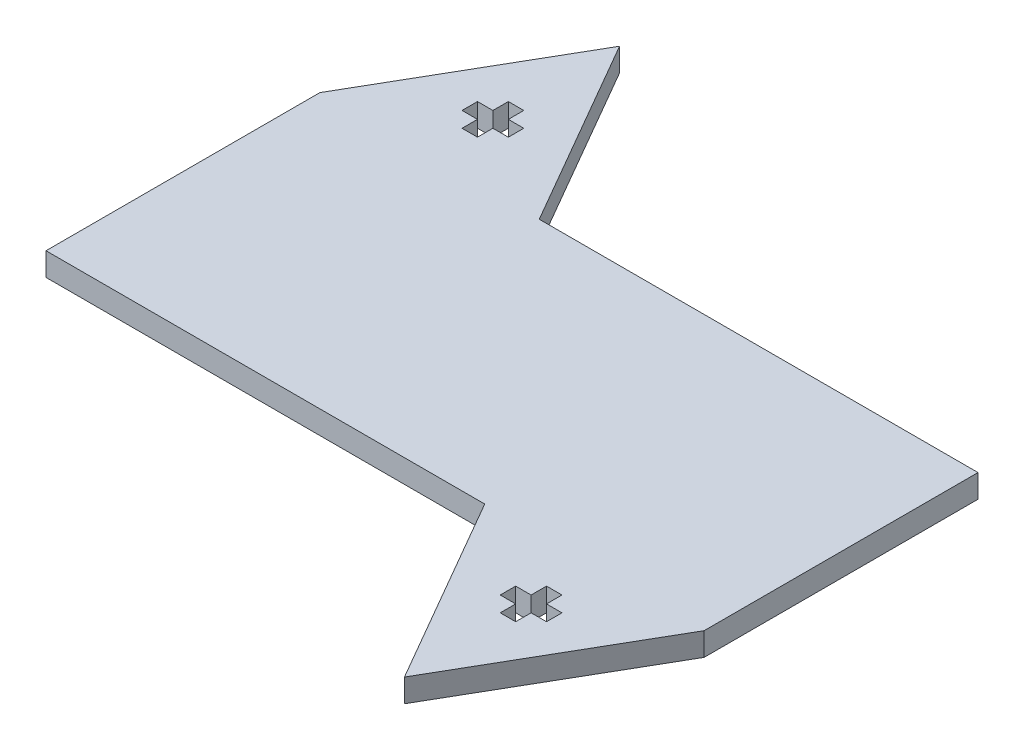
ISO-10303-21;
HEADER;
FILE_DESCRIPTION(('STEP AP214'),'2;1');
FILE_NAME('part.step','',(''),(''),'','','');
FILE_SCHEMA(('AUTOMOTIVE_DESIGN { 1 0 10303 214 1 1 1 1 }'));
ENDSEC;
DATA;
#1=APPLICATION_CONTEXT('core data for automotive mechanical design processes');
#2=APPLICATION_PROTOCOL_DEFINITION('international standard','automotive_design',2000,#1);
#3=PRODUCT_CONTEXT('',#1,'mechanical');
#4=PRODUCT('Part','Part','',(#3));
#5=PRODUCT_RELATED_PRODUCT_CATEGORY('part','',(#4));
#6=PRODUCT_DEFINITION_FORMATION('','',#4);
#7=PRODUCT_DEFINITION_CONTEXT('part definition',#1,'design');
#8=PRODUCT_DEFINITION('design','',#6,#7);
#9=PRODUCT_DEFINITION_SHAPE('','',#8);
#10=(LENGTH_UNIT() NAMED_UNIT(*) SI_UNIT(.MILLI.,.METRE.));
#11=(NAMED_UNIT(*) PLANE_ANGLE_UNIT() SI_UNIT($,.RADIAN.));
#12=(NAMED_UNIT(*) SI_UNIT($,.STERADIAN.) SOLID_ANGLE_UNIT());
#13=UNCERTAINTY_MEASURE_WITH_UNIT(LENGTH_MEASURE(1.E-05),#10,'distance_accuracy_value','');
#14=(GEOMETRIC_REPRESENTATION_CONTEXT(3) GLOBAL_UNCERTAINTY_ASSIGNED_CONTEXT((#13)) GLOBAL_UNIT_ASSIGNED_CONTEXT((#10,
#11,#12)) REPRESENTATION_CONTEXT('',''));
#15=CARTESIAN_POINT('',(0.,0.,0.));
#16=DIRECTION('',(0.,0.,1.));
#17=DIRECTION('',(1.,0.,0.));
#18=AXIS2_PLACEMENT_3D('',#15,#16,#17);
#19=CARTESIAN_POINT('',(0.,7.62,0.));
#20=DIRECTION('',(0.,-1.,0.));
#21=DIRECTION('',(0.,0.,-1.));
#22=AXIS2_PLACEMENT_3D('',#19,#20,#21);
#23=PLANE('',#22);
#24=DIRECTION('',(1.,0.,0.));
#25=VECTOR('',#24,1.);
#26=CARTESIAN_POINT('',(7.70495294117646,7.62,55.6913970588235));
#27=LINE('',#26,#25);
#28=CARTESIAN_POINT('',(2.62495294117646,7.62,55.6913970588235));
#29=VERTEX_POINT('',#28);
#30=CARTESIAN_POINT('',(7.70495294117646,7.62,55.6913970588235));
#31=VERTEX_POINT('',#30);
#32=EDGE_CURVE('E334',#29,#31,#27,.T.);
#33=ORIENTED_EDGE('',*,*,#32,.F.);
#34=DIRECTION('',(0.,0.,-1.));
#35=VECTOR('',#34,1.);
#36=CARTESIAN_POINT('',(2.62495294117646,7.62,55.6913970588235));
#37=LINE('',#36,#35);
#38=CARTESIAN_POINT('',(2.62495294117647,7.62,60.7713970588235));
#39=VERTEX_POINT('',#38);
#40=EDGE_CURVE('E358',#39,#29,#37,.T.);
#41=ORIENTED_EDGE('',*,*,#40,.F.);
#42=DIRECTION('',(1.,0.,0.));
#43=VECTOR('',#42,1.);
#44=CARTESIAN_POINT('',(2.62495294117647,7.62,60.7713970588235));
#45=LINE('',#44,#43);
#46=CARTESIAN_POINT('',(-2.45504705882353,7.62,60.7713970588235));
#47=VERTEX_POINT('',#46);
#48=EDGE_CURVE('E355',#47,#39,#45,.T.);
#49=ORIENTED_EDGE('',*,*,#48,.F.);
#50=DIRECTION('',(0.,0.,1.));
#51=VECTOR('',#50,1.);
#52=CARTESIAN_POINT('',(-2.45504705882353,7.62,60.7713970588235));
#53=LINE('',#52,#51);
#54=CARTESIAN_POINT('',(-2.45504705882354,7.62,55.6913970588235));
#55=VERTEX_POINT('',#54);
#56=EDGE_CURVE('E353',#55,#47,#53,.T.);
#57=ORIENTED_EDGE('',*,*,#56,.F.);
#58=DIRECTION('',(1.,0.,0.));
#59=VECTOR('',#58,1.);
#60=CARTESIAN_POINT('',(-2.45504705882354,7.62,55.6913970588235));
#61=LINE('',#60,#59);
#62=CARTESIAN_POINT('',(-7.53504705882354,7.62,55.6913970588235));
#63=VERTEX_POINT('',#62);
#64=EDGE_CURVE('E351',#63,#55,#61,.T.);
#65=ORIENTED_EDGE('',*,*,#64,.F.);
#66=DIRECTION('',(0.,0.,1.));
#67=VECTOR('',#66,1.);
#68=CARTESIAN_POINT('',(-7.53504705882354,7.62,55.6913970588235));
#69=LINE('',#68,#67);
#70=CARTESIAN_POINT('',(-7.53504705882354,7.62,50.6113970588235));
#71=VERTEX_POINT('',#70);
#72=EDGE_CURVE('E349',#71,#63,#69,.T.);
#73=ORIENTED_EDGE('',*,*,#72,.F.);
#74=DIRECTION('',(-1.,0.,0.));
#75=VECTOR('',#74,1.);
#76=CARTESIAN_POINT('',(-2.45504705882354,7.62,50.6113970588235));
#77=LINE('',#76,#75);
#78=CARTESIAN_POINT('',(-2.45504705882354,7.62,50.6113970588235));
#79=VERTEX_POINT('',#78);
#80=EDGE_CURVE('E347',#79,#71,#77,.T.);
#81=ORIENTED_EDGE('',*,*,#80,.F.);
#82=DIRECTION('',(0.,0.,1.));
#83=VECTOR('',#82,1.);
#84=CARTESIAN_POINT('',(-2.45504705882353,7.62,45.5313970588235));
#85=LINE('',#84,#83);
#86=CARTESIAN_POINT('',(-2.45504705882353,7.62,45.5313970588235));
#87=VERTEX_POINT('',#86);
#88=EDGE_CURVE('E345',#87,#79,#85,.T.);
#89=ORIENTED_EDGE('',*,*,#88,.F.);
#90=DIRECTION('',(-1.,0.,0.));
#91=VECTOR('',#90,1.);
#92=CARTESIAN_POINT('',(2.62495294117647,7.62,45.5313970588235));
#93=LINE('',#92,#91);
#94=CARTESIAN_POINT('',(2.62495294117647,7.62,45.5313970588235));
#95=VERTEX_POINT('',#94);
#96=EDGE_CURVE('E343',#95,#87,#93,.T.);
#97=ORIENTED_EDGE('',*,*,#96,.F.);
#98=DIRECTION('',(0.,0.,-1.));
#99=VECTOR('',#98,1.);
#100=CARTESIAN_POINT('',(2.62495294117646,7.62,50.6113970588235));
#101=LINE('',#100,#99);
#102=CARTESIAN_POINT('',(2.62495294117646,7.62,50.6113970588235));
#103=VERTEX_POINT('',#102);
#104=EDGE_CURVE('E341',#103,#95,#101,.T.);
#105=ORIENTED_EDGE('',*,*,#104,.F.);
#106=DIRECTION('',(-1.,0.,0.));
#107=VECTOR('',#106,1.);
#108=CARTESIAN_POINT('',(7.70495294117646,7.62,50.6113970588235));
#109=LINE('',#108,#107);
#110=CARTESIAN_POINT('',(7.70495294117646,7.62,50.6113970588235));
#111=VERTEX_POINT('',#110);
#112=EDGE_CURVE('E339',#111,#103,#109,.T.);
#113=ORIENTED_EDGE('',*,*,#112,.F.);
#114=DIRECTION('',(0.,0.,-1.));
#115=VECTOR('',#114,1.);
#116=CARTESIAN_POINT('',(7.70495294117646,7.62,50.6113970588235));
#117=LINE('',#116,#115);
#118=EDGE_CURVE('E336',#31,#111,#117,.T.);
#119=ORIENTED_EDGE('',*,*,#118,.F.);
#120=EDGE_LOOP('',(#33,#41,#49,#57,#65,#73,#81,#89,#97,#105,#113,#119));
#121=FACE_BOUND('',#120,.T.);
#122=DIRECTION('',(-0.5,0.,0.866025403784439));
#123=VECTOR('',#122,1.);
#124=CARTESIAN_POINT('',(-180.440047058824,7.62,-57.8529529411765));
#125=LINE('',#124,#123);
#126=CARTESIAN_POINT('',(-144.335047058824,7.62,-120.388647348451));
#127=VERTEX_POINT('',#126);
#128=CARTESIAN_POINT('',(-180.440047058824,7.62,-57.8529529411765));
#129=VERTEX_POINT('',#128);
#130=EDGE_CURVE('E421',#127,#129,#125,.T.);
#131=ORIENTED_EDGE('',*,*,#130,.T.);
#132=DIRECTION('',(0.,0.,1.));
#133=VECTOR('',#132,1.);
#134=CARTESIAN_POINT('',(-180.440047058824,7.62,-57.8529529411765));
#135=LINE('',#134,#133);
#136=CARTESIAN_POINT('',(-180.440047058824,7.62,32.3068870588235));
#137=VERTEX_POINT('',#136);
#138=EDGE_CURVE('E424',#129,#137,#135,.T.);
#139=ORIENTED_EDGE('',*,*,#138,.T.);
#140=DIRECTION('',(1.,0.,0.));
#141=VECTOR('',#140,1.);
#142=CARTESIAN_POINT('',(-180.440047058824,7.62,32.3068870588235));
#143=LINE('',#142,#141);
#144=CARTESIAN_POINT('',(-36.0200470588235,7.62,32.3068870588235));
#145=VERTEX_POINT('',#144);
#146=EDGE_CURVE('E427',#137,#145,#143,.T.);
#147=ORIENTED_EDGE('',*,*,#146,.T.);
#148=DIRECTION('',(0.5,0.,0.866025403784438));
#149=VECTOR('',#148,1.);
#150=CARTESIAN_POINT('',(-36.0200470588235,7.62,32.3068870588235));
#151=LINE('',#150,#149);
#152=CARTESIAN_POINT('',(0.0849529411764832,7.62,94.8425814660978));
#153=VERTEX_POINT('',#152);
#154=EDGE_CURVE('E429',#145,#153,#151,.T.);
#155=ORIENTED_EDGE('',*,*,#154,.T.);
#156=DIRECTION('',(0.5,0.,-0.866025403784439));
#157=VECTOR('',#156,1.);
#158=CARTESIAN_POINT('',(0.0849529411764832,7.62,94.8425814660978));
#159=LINE('',#158,#157);
#160=CARTESIAN_POINT('',(36.1899529411765,7.62,32.3068870588235));
#161=VERTEX_POINT('',#160);
#162=EDGE_CURVE('E431',#153,#161,#159,.T.);
#163=ORIENTED_EDGE('',*,*,#162,.T.);
#164=DIRECTION('',(0.,0.,-1.));
#165=VECTOR('',#164,1.);
#166=CARTESIAN_POINT('',(36.1899529411765,7.62,-57.8529529411765));
#167=LINE('',#166,#165);
#168=CARTESIAN_POINT('',(36.1899529411765,7.62,-57.8529529411765));
#169=VERTEX_POINT('',#168);
#170=EDGE_CURVE('E433',#161,#169,#167,.T.);
#171=ORIENTED_EDGE('',*,*,#170,.T.);
#172=DIRECTION('',(-1.,0.,0.));
#173=VECTOR('',#172,1.);
#174=CARTESIAN_POINT('',(-108.230047058824,7.62,-57.8529529411765));
#175=LINE('',#174,#173);
#176=CARTESIAN_POINT('',(-108.230047058824,7.62,-57.8529529411765));
#177=VERTEX_POINT('',#176);
#178=EDGE_CURVE('E435',#169,#177,#175,.T.);
#179=ORIENTED_EDGE('',*,*,#178,.T.);
#180=DIRECTION('',(-0.5,0.,-0.866025403784439));
#181=VECTOR('',#180,1.);
#182=CARTESIAN_POINT('',(-144.335047058824,7.62,-120.388647348451));
#183=LINE('',#182,#181);
#184=EDGE_CURVE('E437',#177,#127,#183,.T.);
#185=ORIENTED_EDGE('',*,*,#184,.T.);
#186=EDGE_LOOP('',(#131,#139,#147,#155,#163,#171,#179,#185));
#187=FACE_BOUND('',#186,.T.);
#188=DIRECTION('',(1.,0.,0.));
#189=VECTOR('',#188,1.);
#190=CARTESIAN_POINT('',(-136.715047058824,7.62,-76.1574629411765));
#191=LINE('',#190,#189);
#192=CARTESIAN_POINT('',(-141.795047058824,7.62,-76.1574629411765));
#193=VERTEX_POINT('',#192);
#194=CARTESIAN_POINT('',(-136.715047058824,7.62,-76.1574629411765));
#195=VERTEX_POINT('',#194);
#196=EDGE_CURVE('E241',#193,#195,#191,.T.);
#197=ORIENTED_EDGE('',*,*,#196,.F.);
#198=DIRECTION('',(0.,0.,-1.));
#199=VECTOR('',#198,1.);
#200=CARTESIAN_POINT('',(-141.795047058824,7.62,-76.1574629411765));
#201=LINE('',#200,#199);
#202=CARTESIAN_POINT('',(-141.795047058824,7.62,-71.0774629411765));
#203=VERTEX_POINT('',#202);
#204=EDGE_CURVE('E282',#203,#193,#201,.T.);
#205=ORIENTED_EDGE('',*,*,#204,.F.);
#206=DIRECTION('',(1.,0.,0.));
#207=VECTOR('',#206,1.);
#208=CARTESIAN_POINT('',(-141.795047058824,7.62,-71.0774629411765));
#209=LINE('',#208,#207);
#210=CARTESIAN_POINT('',(-146.875047058824,7.62,-71.0774629411765));
#211=VERTEX_POINT('',#210);
#212=EDGE_CURVE('E280',#211,#203,#209,.T.);
#213=ORIENTED_EDGE('',*,*,#212,.F.);
#214=DIRECTION('',(0.,0.,1.));
#215=VECTOR('',#214,1.);
#216=CARTESIAN_POINT('',(-146.875047058824,7.62,-71.0774629411765));
#217=LINE('',#216,#215);
#218=CARTESIAN_POINT('',(-146.875047058824,7.62,-76.1574629411765));
#219=VERTEX_POINT('',#218);
#220=EDGE_CURVE('E278',#219,#211,#217,.T.);
#221=ORIENTED_EDGE('',*,*,#220,.F.);
#222=DIRECTION('',(1.,0.,0.));
#223=VECTOR('',#222,1.);
#224=CARTESIAN_POINT('',(-146.875047058824,7.62,-76.1574629411765));
#225=LINE('',#224,#223);
#226=CARTESIAN_POINT('',(-151.955047058824,7.62,-76.1574629411765));
#227=VERTEX_POINT('',#226);
#228=EDGE_CURVE('E276',#227,#219,#225,.T.);
#229=ORIENTED_EDGE('',*,*,#228,.F.);
#230=DIRECTION('',(0.,0.,1.));
#231=VECTOR('',#230,1.);
#232=CARTESIAN_POINT('',(-151.955047058824,7.62,-76.1574629411765));
#233=LINE('',#232,#231);
#234=CARTESIAN_POINT('',(-151.955047058824,7.62,-81.2374629411765));
#235=VERTEX_POINT('',#234);
#236=EDGE_CURVE('E274',#235,#227,#233,.T.);
#237=ORIENTED_EDGE('',*,*,#236,.F.);
#238=DIRECTION('',(-1.,0.,0.));
#239=VECTOR('',#238,1.);
#240=CARTESIAN_POINT('',(-146.875047058824,7.62,-81.2374629411765));
#241=LINE('',#240,#239);
#242=CARTESIAN_POINT('',(-146.875047058824,7.62,-81.2374629411765));
#243=VERTEX_POINT('',#242);
#244=EDGE_CURVE('E272',#243,#235,#241,.T.);
#245=ORIENTED_EDGE('',*,*,#244,.F.);
#246=DIRECTION('',(0.,0.,1.));
#247=VECTOR('',#246,1.);
#248=CARTESIAN_POINT('',(-146.875047058824,7.62,-86.3174629411765));
#249=LINE('',#248,#247);
#250=CARTESIAN_POINT('',(-146.875047058824,7.62,-86.3174629411765));
#251=VERTEX_POINT('',#250);
#252=EDGE_CURVE('E270',#251,#243,#249,.T.);
#253=ORIENTED_EDGE('',*,*,#252,.F.);
#254=DIRECTION('',(-1.,0.,0.));
#255=VECTOR('',#254,1.);
#256=CARTESIAN_POINT('',(-141.795047058824,7.62,-86.3174629411765));
#257=LINE('',#256,#255);
#258=CARTESIAN_POINT('',(-141.795047058824,7.62,-86.3174629411765));
#259=VERTEX_POINT('',#258);
#260=EDGE_CURVE('E268',#259,#251,#257,.T.);
#261=ORIENTED_EDGE('',*,*,#260,.F.);
#262=DIRECTION('',(0.,0.,-1.));
#263=VECTOR('',#262,1.);
#264=CARTESIAN_POINT('',(-141.795047058824,7.62,-81.2374629411765));
#265=LINE('',#264,#263);
#266=CARTESIAN_POINT('',(-141.795047058824,7.62,-81.2374629411765));
#267=VERTEX_POINT('',#266);
#268=EDGE_CURVE('E264',#267,#259,#265,.T.);
#269=ORIENTED_EDGE('',*,*,#268,.F.);
#270=DIRECTION('',(-1.,0.,0.));
#271=VECTOR('',#270,1.);
#272=CARTESIAN_POINT('',(-136.715047058824,7.62,-81.2374629411765));
#273=LINE('',#272,#271);
#274=CARTESIAN_POINT('',(-136.715047058824,7.62,-81.2374629411765));
#275=VERTEX_POINT('',#274);
#276=EDGE_CURVE('E262',#275,#267,#273,.T.);
#277=ORIENTED_EDGE('',*,*,#276,.F.);
#278=DIRECTION('',(0.,0.,-1.));
#279=VECTOR('',#278,1.);
#280=CARTESIAN_POINT('',(-136.715047058824,7.62,-81.2374629411765));
#281=LINE('',#280,#279);
#282=EDGE_CURVE('E249',#195,#275,#281,.T.);
#283=ORIENTED_EDGE('',*,*,#282,.F.);
#284=EDGE_LOOP('',(#197,#205,#213,#221,#229,#237,#245,#253,#261,#269,#277,#283));
#285=FACE_BOUND('',#284,.T.);
#286=ADVANCED_FACE('F32',(#121,#187,#285),#23,.F.);
#287=CARTESIAN_POINT('',(0.,0.,0.));
#288=DIRECTION('',(0.,-1.,0.));
#289=DIRECTION('',(0.,0.,-1.));
#290=AXIS2_PLACEMENT_3D('',#287,#288,#289);
#291=PLANE('',#290);
#292=DIRECTION('',(-0.5,0.,0.866025403784439));
#293=VECTOR('',#292,1.);
#294=CARTESIAN_POINT('',(-180.440047058824,0.,-57.8529529411765));
#295=LINE('',#294,#293);
#296=CARTESIAN_POINT('',(-144.335047058824,0.,-120.388647348451));
#297=VERTEX_POINT('',#296);
#298=CARTESIAN_POINT('',(-180.440047058824,0.,-57.8529529411765));
#299=VERTEX_POINT('',#298);
#300=EDGE_CURVE('E420',#297,#299,#295,.T.);
#301=ORIENTED_EDGE('',*,*,#300,.F.);
#302=DIRECTION('',(-0.5,0.,-0.866025403784439));
#303=VECTOR('',#302,1.);
#304=CARTESIAN_POINT('',(-144.335047058824,0.,-120.388647348451));
#305=LINE('',#304,#303);
#306=CARTESIAN_POINT('',(-108.230047058824,0.,-57.8529529411765));
#307=VERTEX_POINT('',#306);
#308=EDGE_CURVE('E425',#307,#297,#305,.T.);
#309=ORIENTED_EDGE('',*,*,#308,.F.);
#310=DIRECTION('',(-1.,0.,0.));
#311=VECTOR('',#310,1.);
#312=CARTESIAN_POINT('',(-108.230047058824,0.,-57.8529529411765));
#313=LINE('',#312,#311);
#314=CARTESIAN_POINT('',(36.1899529411765,0.,-57.8529529411765));
#315=VERTEX_POINT('',#314);
#316=EDGE_CURVE('E452',#315,#307,#313,.T.);
#317=ORIENTED_EDGE('',*,*,#316,.F.);
#318=DIRECTION('',(0.,0.,-1.));
#319=VECTOR('',#318,1.);
#320=CARTESIAN_POINT('',(36.1899529411765,0.,-57.8529529411765));
#321=LINE('',#320,#319);
#322=CARTESIAN_POINT('',(36.1899529411765,0.,32.3068870588235));
#323=VERTEX_POINT('',#322);
#324=EDGE_CURVE('E450',#323,#315,#321,.T.);
#325=ORIENTED_EDGE('',*,*,#324,.F.);
#326=DIRECTION('',(0.5,0.,-0.866025403784439));
#327=VECTOR('',#326,1.);
#328=CARTESIAN_POINT('',(0.0849529411764832,0.,94.8425814660978));
#329=LINE('',#328,#327);
#330=CARTESIAN_POINT('',(0.0849529411764832,0.,94.8425814660978));
#331=VERTEX_POINT('',#330);
#332=EDGE_CURVE('E448',#331,#323,#329,.T.);
#333=ORIENTED_EDGE('',*,*,#332,.F.);
#334=DIRECTION('',(0.5,0.,0.866025403784438));
#335=VECTOR('',#334,1.);
#336=CARTESIAN_POINT('',(-36.0200470588235,0.,32.3068870588235));
#337=LINE('',#336,#335);
#338=CARTESIAN_POINT('',(-36.0200470588235,0.,32.3068870588235));
#339=VERTEX_POINT('',#338);
#340=EDGE_CURVE('E446',#339,#331,#337,.T.);
#341=ORIENTED_EDGE('',*,*,#340,.F.);
#342=DIRECTION('',(1.,0.,0.));
#343=VECTOR('',#342,1.);
#344=CARTESIAN_POINT('',(-180.440047058824,0.,32.3068870588235));
#345=LINE('',#344,#343);
#346=CARTESIAN_POINT('',(-180.440047058824,0.,32.3068870588235));
#347=VERTEX_POINT('',#346);
#348=EDGE_CURVE('E444',#347,#339,#345,.T.);
#349=ORIENTED_EDGE('',*,*,#348,.F.);
#350=DIRECTION('',(0.,0.,1.));
#351=VECTOR('',#350,1.);
#352=CARTESIAN_POINT('',(-180.440047058824,0.,-57.8529529411765));
#353=LINE('',#352,#351);
#354=EDGE_CURVE('E442',#299,#347,#353,.T.);
#355=ORIENTED_EDGE('',*,*,#354,.F.);
#356=EDGE_LOOP('',(#301,#309,#317,#325,#333,#341,#349,#355));
#357=FACE_BOUND('',#356,.T.);
#358=DIRECTION('',(0.,0.,-1.));
#359=VECTOR('',#358,1.);
#360=CARTESIAN_POINT('',(2.62495294117646,0.,55.6913970588235));
#361=LINE('',#360,#359);
#362=CARTESIAN_POINT('',(2.62495294117647,0.,60.7713970588235));
#363=VERTEX_POINT('',#362);
#364=CARTESIAN_POINT('',(2.62495294117646,0.,55.6913970588235));
#365=VERTEX_POINT('',#364);
#366=EDGE_CURVE('E337',#363,#365,#361,.T.);
#367=ORIENTED_EDGE('',*,*,#366,.T.);
#368=DIRECTION('',(1.,0.,0.));
#369=VECTOR('',#368,1.);
#370=CARTESIAN_POINT('',(7.70495294117646,0.,55.6913970588235));
#371=LINE('',#370,#369);
#372=CARTESIAN_POINT('',(7.70495294117646,0.,55.6913970588235));
#373=VERTEX_POINT('',#372);
#374=EDGE_CURVE('E257',#365,#373,#371,.T.);
#375=ORIENTED_EDGE('',*,*,#374,.T.);
#376=DIRECTION('',(0.,0.,-1.));
#377=VECTOR('',#376,1.);
#378=CARTESIAN_POINT('',(7.70495294117646,0.,50.6113970588235));
#379=LINE('',#378,#377);
#380=CARTESIAN_POINT('',(7.70495294117646,0.,50.6113970588235));
#381=VERTEX_POINT('',#380);
#382=EDGE_CURVE('E363',#373,#381,#379,.T.);
#383=ORIENTED_EDGE('',*,*,#382,.T.);
#384=DIRECTION('',(-1.,0.,0.));
#385=VECTOR('',#384,1.);
#386=CARTESIAN_POINT('',(7.70495294117646,0.,50.6113970588235));
#387=LINE('',#386,#385);
#388=CARTESIAN_POINT('',(2.62495294117646,0.,50.6113970588235));
#389=VERTEX_POINT('',#388);
#390=EDGE_CURVE('E366',#381,#389,#387,.T.);
#391=ORIENTED_EDGE('',*,*,#390,.T.);
#392=DIRECTION('',(0.,0.,-1.));
#393=VECTOR('',#392,1.);
#394=CARTESIAN_POINT('',(2.62495294117646,0.,50.6113970588235));
#395=LINE('',#394,#393);
#396=CARTESIAN_POINT('',(2.62495294117647,0.,45.5313970588235));
#397=VERTEX_POINT('',#396);
#398=EDGE_CURVE('E369',#389,#397,#395,.T.);
#399=ORIENTED_EDGE('',*,*,#398,.T.);
#400=DIRECTION('',(-1.,0.,0.));
#401=VECTOR('',#400,1.);
#402=CARTESIAN_POINT('',(2.62495294117647,0.,45.5313970588235));
#403=LINE('',#402,#401);
#404=CARTESIAN_POINT('',(-2.45504705882353,0.,45.5313970588235));
#405=VERTEX_POINT('',#404);
#406=EDGE_CURVE('E372',#397,#405,#403,.T.);
#407=ORIENTED_EDGE('',*,*,#406,.T.);
#408=DIRECTION('',(0.,0.,1.));
#409=VECTOR('',#408,1.);
#410=CARTESIAN_POINT('',(-2.45504705882353,0.,45.5313970588235));
#411=LINE('',#410,#409);
#412=CARTESIAN_POINT('',(-2.45504705882354,0.,50.6113970588235));
#413=VERTEX_POINT('',#412);
#414=EDGE_CURVE('E375',#405,#413,#411,.T.);
#415=ORIENTED_EDGE('',*,*,#414,.T.);
#416=DIRECTION('',(-1.,0.,0.));
#417=VECTOR('',#416,1.);
#418=CARTESIAN_POINT('',(-2.45504705882354,0.,50.6113970588235));
#419=LINE('',#418,#417);
#420=CARTESIAN_POINT('',(-7.53504705882354,0.,50.6113970588235));
#421=VERTEX_POINT('',#420);
#422=EDGE_CURVE('E378',#413,#421,#419,.T.);
#423=ORIENTED_EDGE('',*,*,#422,.T.);
#424=DIRECTION('',(0.,0.,1.));
#425=VECTOR('',#424,1.);
#426=CARTESIAN_POINT('',(-7.53504705882354,0.,55.6913970588235));
#427=LINE('',#426,#425);
#428=CARTESIAN_POINT('',(-7.53504705882354,0.,55.6913970588235));
#429=VERTEX_POINT('',#428);
#430=EDGE_CURVE('E381',#421,#429,#427,.T.);
#431=ORIENTED_EDGE('',*,*,#430,.T.);
#432=DIRECTION('',(1.,0.,0.));
#433=VECTOR('',#432,1.);
#434=CARTESIAN_POINT('',(-2.45504705882354,0.,55.6913970588235));
#435=LINE('',#434,#433);
#436=CARTESIAN_POINT('',(-2.45504705882354,0.,55.6913970588235));
#437=VERTEX_POINT('',#436);
#438=EDGE_CURVE('E384',#429,#437,#435,.T.);
#439=ORIENTED_EDGE('',*,*,#438,.T.);
#440=DIRECTION('',(0.,0.,1.));
#441=VECTOR('',#440,1.);
#442=CARTESIAN_POINT('',(-2.45504705882353,0.,60.7713970588235));
#443=LINE('',#442,#441);
#444=CARTESIAN_POINT('',(-2.45504705882353,0.,60.7713970588235));
#445=VERTEX_POINT('',#444);
#446=EDGE_CURVE('E387',#437,#445,#443,.T.);
#447=ORIENTED_EDGE('',*,*,#446,.T.);
#448=DIRECTION('',(1.,0.,0.));
#449=VECTOR('',#448,1.);
#450=CARTESIAN_POINT('',(2.62495294117647,0.,60.7713970588235));
#451=LINE('',#450,#449);
#452=EDGE_CURVE('E390',#445,#363,#451,.T.);
#453=ORIENTED_EDGE('',*,*,#452,.T.);
#454=EDGE_LOOP('',(#367,#375,#383,#391,#399,#407,#415,#423,#431,#439,#447,#453));
#455=FACE_BOUND('',#454,.T.);
#456=DIRECTION('',(0.,0.,-1.));
#457=VECTOR('',#456,1.);
#458=CARTESIAN_POINT('',(-141.795047058824,0.,-76.1574629411765));
#459=LINE('',#458,#457);
#460=CARTESIAN_POINT('',(-141.795047058824,0.,-71.0774629411765));
#461=VERTEX_POINT('',#460);
#462=CARTESIAN_POINT('',(-141.795047058824,0.,-76.1574629411765));
#463=VERTEX_POINT('',#462);
#464=EDGE_CURVE('E250',#461,#463,#459,.T.);
#465=ORIENTED_EDGE('',*,*,#464,.T.);
#466=DIRECTION('',(1.,0.,0.));
#467=VECTOR('',#466,1.);
#468=CARTESIAN_POINT('',(-136.715047058824,0.,-76.1574629411765));
#469=LINE('',#468,#467);
#470=CARTESIAN_POINT('',(-136.715047058824,0.,-76.1574629411765));
#471=VERTEX_POINT('',#470);
#472=EDGE_CURVE('E55',#463,#471,#469,.T.);
#473=ORIENTED_EDGE('',*,*,#472,.T.);
#474=DIRECTION('',(0.,0.,-1.));
#475=VECTOR('',#474,1.);
#476=CARTESIAN_POINT('',(-136.715047058824,0.,-81.2374629411765));
#477=LINE('',#476,#475);
#478=CARTESIAN_POINT('',(-136.715047058824,0.,-81.2374629411765));
#479=VERTEX_POINT('',#478);
#480=EDGE_CURVE('E256',#471,#479,#477,.T.);
#481=ORIENTED_EDGE('',*,*,#480,.T.);
#482=DIRECTION('',(-1.,0.,0.));
#483=VECTOR('',#482,1.);
#484=CARTESIAN_POINT('',(-136.715047058824,0.,-81.2374629411765));
#485=LINE('',#484,#483);
#486=CARTESIAN_POINT('',(-141.795047058824,0.,-81.2374629411765));
#487=VERTEX_POINT('',#486);
#488=EDGE_CURVE('E286',#479,#487,#485,.T.);
#489=ORIENTED_EDGE('',*,*,#488,.T.);
#490=DIRECTION('',(0.,0.,-1.));
#491=VECTOR('',#490,1.);
#492=CARTESIAN_POINT('',(-141.795047058824,0.,-81.2374629411765));
#493=LINE('',#492,#491);
#494=CARTESIAN_POINT('',(-141.795047058824,0.,-86.3174629411765));
#495=VERTEX_POINT('',#494);
#496=EDGE_CURVE('E289',#487,#495,#493,.T.);
#497=ORIENTED_EDGE('',*,*,#496,.T.);
#498=DIRECTION('',(-1.,0.,0.));
#499=VECTOR('',#498,1.);
#500=CARTESIAN_POINT('',(-141.795047058824,0.,-86.3174629411765));
#501=LINE('',#500,#499);
#502=CARTESIAN_POINT('',(-146.875047058824,0.,-86.3174629411765));
#503=VERTEX_POINT('',#502);
#504=EDGE_CURVE('E292',#495,#503,#501,.T.);
#505=ORIENTED_EDGE('',*,*,#504,.T.);
#506=DIRECTION('',(0.,0.,1.));
#507=VECTOR('',#506,1.);
#508=CARTESIAN_POINT('',(-146.875047058824,0.,-86.3174629411765));
#509=LINE('',#508,#507);
#510=CARTESIAN_POINT('',(-146.875047058824,0.,-81.2374629411765));
#511=VERTEX_POINT('',#510);
#512=EDGE_CURVE('E295',#503,#511,#509,.T.);
#513=ORIENTED_EDGE('',*,*,#512,.T.);
#514=DIRECTION('',(-1.,0.,0.));
#515=VECTOR('',#514,1.);
#516=CARTESIAN_POINT('',(-146.875047058824,0.,-81.2374629411765));
#517=LINE('',#516,#515);
#518=CARTESIAN_POINT('',(-151.955047058824,0.,-81.2374629411765));
#519=VERTEX_POINT('',#518);
#520=EDGE_CURVE('E298',#511,#519,#517,.T.);
#521=ORIENTED_EDGE('',*,*,#520,.T.);
#522=DIRECTION('',(0.,0.,1.));
#523=VECTOR('',#522,1.);
#524=CARTESIAN_POINT('',(-151.955047058824,0.,-76.1574629411765));
#525=LINE('',#524,#523);
#526=CARTESIAN_POINT('',(-151.955047058824,0.,-76.1574629411765));
#527=VERTEX_POINT('',#526);
#528=EDGE_CURVE('E301',#519,#527,#525,.T.);
#529=ORIENTED_EDGE('',*,*,#528,.T.);
#530=DIRECTION('',(1.,0.,0.));
#531=VECTOR('',#530,1.);
#532=CARTESIAN_POINT('',(-146.875047058824,0.,-76.1574629411765));
#533=LINE('',#532,#531);
#534=CARTESIAN_POINT('',(-146.875047058824,0.,-76.1574629411765));
#535=VERTEX_POINT('',#534);
#536=EDGE_CURVE('E304',#527,#535,#533,.T.);
#537=ORIENTED_EDGE('',*,*,#536,.T.);
#538=DIRECTION('',(0.,0.,1.));
#539=VECTOR('',#538,1.);
#540=CARTESIAN_POINT('',(-146.875047058824,0.,-71.0774629411765));
#541=LINE('',#540,#539);
#542=CARTESIAN_POINT('',(-146.875047058824,0.,-71.0774629411765));
#543=VERTEX_POINT('',#542);
#544=EDGE_CURVE('E307',#535,#543,#541,.T.);
#545=ORIENTED_EDGE('',*,*,#544,.T.);
#546=DIRECTION('',(1.,0.,0.));
#547=VECTOR('',#546,1.);
#548=CARTESIAN_POINT('',(-141.795047058824,0.,-71.0774629411765));
#549=LINE('',#548,#547);
#550=EDGE_CURVE('E310',#543,#461,#549,.T.);
#551=ORIENTED_EDGE('',*,*,#550,.T.);
#552=EDGE_LOOP('',(#465,#473,#481,#489,#497,#505,#513,#521,#529,#537,#545,#551));
#553=FACE_BOUND('',#552,.T.);
#554=ADVANCED_FACE('F482',(#357,#455,#553),#291,.T.);
#555=CARTESIAN_POINT('',(-180.440047058824,7.62,-57.8529529411765));
#556=DIRECTION('',(0.866025403784439,0.,0.5));
#557=DIRECTION('',(0.5,0.,-0.866025403784439));
#558=AXIS2_PLACEMENT_3D('',#555,#556,#557);
#559=PLANE('',#558);
#560=ORIENTED_EDGE('',*,*,#300,.T.);
#561=DIRECTION('',(0.,-1.,0.));
#562=VECTOR('',#561,1.);
#563=CARTESIAN_POINT('',(-180.440047058824,7.62,-57.8529529411765));
#564=LINE('',#563,#562);
#565=EDGE_CURVE('E11',#129,#299,#564,.T.);
#566=ORIENTED_EDGE('',*,*,#565,.F.);
#567=ORIENTED_EDGE('',*,*,#130,.F.);
#568=DIRECTION('',(0.,-1.,0.));
#569=VECTOR('',#568,1.);
#570=CARTESIAN_POINT('',(-144.335047058824,7.62,-120.388647348451));
#571=LINE('',#570,#569);
#572=EDGE_CURVE('E439',#127,#297,#571,.T.);
#573=ORIENTED_EDGE('',*,*,#572,.T.);
#574=EDGE_LOOP('',(#560,#566,#567,#573));
#575=FACE_BOUND('',#574,.T.);
#576=ADVANCED_FACE('F34',(#575),#559,.F.);
#577=CARTESIAN_POINT('',(-180.440047058824,7.62,-57.8529529411765));
#578=DIRECTION('',(1.,0.,0.));
#579=DIRECTION('',(0.,0.,-1.));
#580=AXIS2_PLACEMENT_3D('',#577,#578,#579);
#581=PLANE('',#580);
#582=ORIENTED_EDGE('',*,*,#354,.T.);
#583=DIRECTION('',(0.,-1.,0.));
#584=VECTOR('',#583,1.);
#585=CARTESIAN_POINT('',(-180.440047058824,7.62,32.3068870588235));
#586=LINE('',#585,#584);
#587=EDGE_CURVE('E40',#137,#347,#586,.T.);
#588=ORIENTED_EDGE('',*,*,#587,.F.);
#589=ORIENTED_EDGE('',*,*,#138,.F.);
#590=ORIENTED_EDGE('',*,*,#565,.T.);
#591=EDGE_LOOP('',(#582,#588,#589,#590));
#592=FACE_BOUND('',#591,.T.);
#593=ADVANCED_FACE('F499',(#592),#581,.F.);
#594=CARTESIAN_POINT('',(-180.440047058824,7.62,32.3068870588235));
#595=DIRECTION('',(0.,0.,-1.));
#596=DIRECTION('',(-1.,0.,0.));
#597=AXIS2_PLACEMENT_3D('',#594,#595,#596);
#598=PLANE('',#597);
#599=ORIENTED_EDGE('',*,*,#348,.T.);
#600=DIRECTION('',(0.,-1.,0.));
#601=VECTOR('',#600,1.);
#602=CARTESIAN_POINT('',(-36.0200470588235,7.62,32.3068870588235));
#603=LINE('',#602,#601);
#604=EDGE_CURVE('E469',#145,#339,#603,.T.);
#605=ORIENTED_EDGE('',*,*,#604,.F.);
#606=ORIENTED_EDGE('',*,*,#146,.F.);
#607=ORIENTED_EDGE('',*,*,#587,.T.);
#608=EDGE_LOOP('',(#599,#605,#606,#607));
#609=FACE_BOUND('',#608,.T.);
#610=ADVANCED_FACE('F476',(#609),#598,.F.);
#611=CARTESIAN_POINT('',(-36.0200470588235,7.62,32.3068870588235));
#612=DIRECTION('',(0.866025403784438,0.,-0.5));
#613=DIRECTION('',(-0.5,0.,-0.866025403784439));
#614=AXIS2_PLACEMENT_3D('',#611,#612,#613);
#615=PLANE('',#614);
#616=ORIENTED_EDGE('',*,*,#340,.T.);
#617=DIRECTION('',(0.,-1.,0.));
#618=VECTOR('',#617,1.);
#619=CARTESIAN_POINT('',(0.0849529411764832,7.62,94.8425814660978));
#620=LINE('',#619,#618);
#621=EDGE_CURVE('E466',#153,#331,#620,.T.);
#622=ORIENTED_EDGE('',*,*,#621,.F.);
#623=ORIENTED_EDGE('',*,*,#154,.F.);
#624=ORIENTED_EDGE('',*,*,#604,.T.);
#625=EDGE_LOOP('',(#616,#622,#623,#624));
#626=FACE_BOUND('',#625,.T.);
#627=ADVANCED_FACE('F488',(#626),#615,.F.);
#628=CARTESIAN_POINT('',(0.0849529411764832,7.62,94.8425814660978));
#629=DIRECTION('',(-0.866025403784439,0.,-0.5));
#630=DIRECTION('',(-0.5,0.,0.866025403784439));
#631=AXIS2_PLACEMENT_3D('',#628,#629,#630);
#632=PLANE('',#631);
#633=ORIENTED_EDGE('',*,*,#332,.T.);
#634=DIRECTION('',(0.,-1.,0.));
#635=VECTOR('',#634,1.);
#636=CARTESIAN_POINT('',(36.1899529411765,7.62,32.3068870588235));
#637=LINE('',#636,#635);
#638=EDGE_CURVE('E463',#161,#323,#637,.T.);
#639=ORIENTED_EDGE('',*,*,#638,.F.);
#640=ORIENTED_EDGE('',*,*,#162,.F.);
#641=ORIENTED_EDGE('',*,*,#621,.T.);
#642=EDGE_LOOP('',(#633,#639,#640,#641));
#643=FACE_BOUND('',#642,.T.);
#644=ADVANCED_FACE('F492',(#643),#632,.F.);
#645=CARTESIAN_POINT('',(36.1899529411765,7.62,-57.8529529411765));
#646=DIRECTION('',(-1.,0.,0.));
#647=DIRECTION('',(0.,0.,1.));
#648=AXIS2_PLACEMENT_3D('',#645,#646,#647);
#649=PLANE('',#648);
#650=ORIENTED_EDGE('',*,*,#324,.T.);
#651=DIRECTION('',(0.,-1.,0.));
#652=VECTOR('',#651,1.);
#653=CARTESIAN_POINT('',(36.1899529411765,7.62,-57.8529529411765));
#654=LINE('',#653,#652);
#655=EDGE_CURVE('E460',#169,#315,#654,.T.);
#656=ORIENTED_EDGE('',*,*,#655,.F.);
#657=ORIENTED_EDGE('',*,*,#170,.F.);
#658=ORIENTED_EDGE('',*,*,#638,.T.);
#659=EDGE_LOOP('',(#650,#656,#657,#658));
#660=FACE_BOUND('',#659,.T.);
#661=ADVANCED_FACE('F512',(#660),#649,.F.);
#662=CARTESIAN_POINT('',(-108.230047058824,7.62,-57.8529529411765));
#663=DIRECTION('',(0.,0.,1.));
#664=DIRECTION('',(1.,0.,0.));
#665=AXIS2_PLACEMENT_3D('',#662,#663,#664);
#666=PLANE('',#665);
#667=ORIENTED_EDGE('',*,*,#316,.T.);
#668=DIRECTION('',(0.,-1.,0.));
#669=VECTOR('',#668,1.);
#670=CARTESIAN_POINT('',(-108.230047058824,7.62,-57.8529529411765));
#671=LINE('',#670,#669);
#672=EDGE_CURVE('E457',#177,#307,#671,.T.);
#673=ORIENTED_EDGE('',*,*,#672,.F.);
#674=ORIENTED_EDGE('',*,*,#178,.F.);
#675=ORIENTED_EDGE('',*,*,#655,.T.);
#676=EDGE_LOOP('',(#667,#673,#674,#675));
#677=FACE_BOUND('',#676,.T.);
#678=ADVANCED_FACE('F510',(#677),#666,.F.);
#679=CARTESIAN_POINT('',(-144.335047058824,7.62,-120.388647348451));
#680=DIRECTION('',(-0.866025403784439,0.,0.5));
#681=DIRECTION('',(0.5,0.,0.866025403784439));
#682=AXIS2_PLACEMENT_3D('',#679,#680,#681);
#683=PLANE('',#682);
#684=ORIENTED_EDGE('',*,*,#308,.T.);
#685=ORIENTED_EDGE('',*,*,#572,.F.);
#686=ORIENTED_EDGE('',*,*,#184,.F.);
#687=ORIENTED_EDGE('',*,*,#672,.T.);
#688=EDGE_LOOP('',(#684,#685,#686,#687));
#689=FACE_BOUND('',#688,.T.);
#690=ADVANCED_FACE('F505',(#689),#683,.F.);
#691=CARTESIAN_POINT('',(7.70495294117646,7.62,55.6913970588235));
#692=DIRECTION('',(0.,0.,-1.));
#693=DIRECTION('',(-1.,0.,0.));
#694=AXIS2_PLACEMENT_3D('',#691,#692,#693);
#695=PLANE('',#694);
#696=ORIENTED_EDGE('',*,*,#374,.F.);
#697=DIRECTION('',(0.,-1.,0.));
#698=VECTOR('',#697,1.);
#699=CARTESIAN_POINT('',(2.62495294117646,7.62,55.6913970588235));
#700=LINE('',#699,#698);
#701=EDGE_CURVE('E360',#29,#365,#700,.T.);
#702=ORIENTED_EDGE('',*,*,#701,.F.);
#703=ORIENTED_EDGE('',*,*,#32,.T.);
#704=DIRECTION('',(0.,-1.,0.));
#705=VECTOR('',#704,1.);
#706=CARTESIAN_POINT('',(7.70495294117646,7.62,55.6913970588235));
#707=LINE('',#706,#705);
#708=EDGE_CURVE('E417',#31,#373,#707,.T.);
#709=ORIENTED_EDGE('',*,*,#708,.T.);
#710=EDGE_LOOP('',(#696,#702,#703,#709));
#711=FACE_BOUND('',#710,.T.);
#712=ADVANCED_FACE('F530',(#711),#695,.T.);
#713=CARTESIAN_POINT('',(7.70495294117646,7.62,50.6113970588235));
#714=DIRECTION('',(-1.,0.,0.));
#715=DIRECTION('',(0.,0.,1.));
#716=AXIS2_PLACEMENT_3D('',#713,#714,#715);
#717=PLANE('',#716);
#718=ORIENTED_EDGE('',*,*,#382,.F.);
#719=ORIENTED_EDGE('',*,*,#708,.F.);
#720=ORIENTED_EDGE('',*,*,#118,.T.);
#721=DIRECTION('',(0.,-1.,0.));
#722=VECTOR('',#721,1.);
#723=CARTESIAN_POINT('',(7.70495294117646,7.62,50.6113970588235));
#724=LINE('',#723,#722);
#725=EDGE_CURVE('E415',#111,#381,#724,.T.);
#726=ORIENTED_EDGE('',*,*,#725,.T.);
#727=EDGE_LOOP('',(#718,#719,#720,#726));
#728=FACE_BOUND('',#727,.T.);
#729=ADVANCED_FACE('F537',(#728),#717,.T.);
#730=CARTESIAN_POINT('',(7.70495294117646,7.62,50.6113970588235));
#731=DIRECTION('',(0.,0.,1.));
#732=DIRECTION('',(1.,0.,0.));
#733=AXIS2_PLACEMENT_3D('',#730,#731,#732);
#734=PLANE('',#733);
#735=ORIENTED_EDGE('',*,*,#390,.F.);
#736=ORIENTED_EDGE('',*,*,#725,.F.);
#737=ORIENTED_EDGE('',*,*,#112,.T.);
#738=DIRECTION('',(0.,-1.,0.));
#739=VECTOR('',#738,1.);
#740=CARTESIAN_POINT('',(2.62495294117646,7.62,50.6113970588235));
#741=LINE('',#740,#739);
#742=EDGE_CURVE('E413',#103,#389,#741,.T.);
#743=ORIENTED_EDGE('',*,*,#742,.T.);
#744=EDGE_LOOP('',(#735,#736,#737,#743));
#745=FACE_BOUND('',#744,.T.);
#746=ADVANCED_FACE('F542',(#745),#734,.T.);
#747=CARTESIAN_POINT('',(2.62495294117646,7.62,50.6113970588235));
#748=DIRECTION('',(-1.,0.,0.));
#749=DIRECTION('',(0.,0.,1.));
#750=AXIS2_PLACEMENT_3D('',#747,#748,#749);
#751=PLANE('',#750);
#752=ORIENTED_EDGE('',*,*,#398,.F.);
#753=ORIENTED_EDGE('',*,*,#742,.F.);
#754=ORIENTED_EDGE('',*,*,#104,.T.);
#755=DIRECTION('',(0.,-1.,0.));
#756=VECTOR('',#755,1.);
#757=CARTESIAN_POINT('',(2.62495294117647,7.62,45.5313970588235));
#758=LINE('',#757,#756);
#759=EDGE_CURVE('E411',#95,#397,#758,.T.);
#760=ORIENTED_EDGE('',*,*,#759,.T.);
#761=EDGE_LOOP('',(#752,#753,#754,#760));
#762=FACE_BOUND('',#761,.T.);
#763=ADVANCED_FACE('F567',(#762),#751,.T.);
#764=CARTESIAN_POINT('',(2.62495294117647,7.62,45.5313970588235));
#765=DIRECTION('',(0.,0.,1.));
#766=DIRECTION('',(1.,0.,0.));
#767=AXIS2_PLACEMENT_3D('',#764,#765,#766);
#768=PLANE('',#767);
#769=ORIENTED_EDGE('',*,*,#406,.F.);
#770=ORIENTED_EDGE('',*,*,#759,.F.);
#771=ORIENTED_EDGE('',*,*,#96,.T.);
#772=DIRECTION('',(0.,-1.,0.));
#773=VECTOR('',#772,1.);
#774=CARTESIAN_POINT('',(-2.45504705882353,7.62,45.5313970588235));
#775=LINE('',#774,#773);
#776=EDGE_CURVE('E409',#87,#405,#775,.T.);
#777=ORIENTED_EDGE('',*,*,#776,.T.);
#778=EDGE_LOOP('',(#769,#770,#771,#777));
#779=FACE_BOUND('',#778,.T.);
#780=ADVANCED_FACE('F572',(#779),#768,.T.);
#781=CARTESIAN_POINT('',(-2.45504705882353,7.62,45.5313970588235));
#782=DIRECTION('',(1.,0.,0.));
#783=DIRECTION('',(0.,0.,-1.));
#784=AXIS2_PLACEMENT_3D('',#781,#782,#783);
#785=PLANE('',#784);
#786=ORIENTED_EDGE('',*,*,#414,.F.);
#787=ORIENTED_EDGE('',*,*,#776,.F.);
#788=ORIENTED_EDGE('',*,*,#88,.T.);
#789=DIRECTION('',(0.,-1.,0.));
#790=VECTOR('',#789,1.);
#791=CARTESIAN_POINT('',(-2.45504705882354,7.62,50.6113970588235));
#792=LINE('',#791,#790);
#793=EDGE_CURVE('E407',#79,#413,#792,.T.);
#794=ORIENTED_EDGE('',*,*,#793,.T.);
#795=EDGE_LOOP('',(#786,#787,#788,#794));
#796=FACE_BOUND('',#795,.T.);
#797=ADVANCED_FACE('F577',(#796),#785,.T.);
#798=CARTESIAN_POINT('',(-2.45504705882354,7.62,50.6113970588235));
#799=DIRECTION('',(0.,0.,1.));
#800=DIRECTION('',(1.,0.,0.));
#801=AXIS2_PLACEMENT_3D('',#798,#799,#800);
#802=PLANE('',#801);
#803=ORIENTED_EDGE('',*,*,#422,.F.);
#804=ORIENTED_EDGE('',*,*,#793,.F.);
#805=ORIENTED_EDGE('',*,*,#80,.T.);
#806=DIRECTION('',(0.,-1.,0.));
#807=VECTOR('',#806,1.);
#808=CARTESIAN_POINT('',(-7.53504705882354,7.62,50.6113970588235));
#809=LINE('',#808,#807);
#810=EDGE_CURVE('E405',#71,#421,#809,.T.);
#811=ORIENTED_EDGE('',*,*,#810,.T.);
#812=EDGE_LOOP('',(#803,#804,#805,#811));
#813=FACE_BOUND('',#812,.T.);
#814=ADVANCED_FACE('F582',(#813),#802,.T.);
#815=CARTESIAN_POINT('',(-7.53504705882354,7.62,55.6913970588235));
#816=DIRECTION('',(1.,0.,0.));
#817=DIRECTION('',(0.,0.,-1.));
#818=AXIS2_PLACEMENT_3D('',#815,#816,#817);
#819=PLANE('',#818);
#820=ORIENTED_EDGE('',*,*,#430,.F.);
#821=ORIENTED_EDGE('',*,*,#810,.F.);
#822=ORIENTED_EDGE('',*,*,#72,.T.);
#823=DIRECTION('',(0.,-1.,0.));
#824=VECTOR('',#823,1.);
#825=CARTESIAN_POINT('',(-7.53504705882354,7.62,55.6913970588235));
#826=LINE('',#825,#824);
#827=EDGE_CURVE('E403',#63,#429,#826,.T.);
#828=ORIENTED_EDGE('',*,*,#827,.T.);
#829=EDGE_LOOP('',(#820,#821,#822,#828));
#830=FACE_BOUND('',#829,.T.);
#831=ADVANCED_FACE('F587',(#830),#819,.T.);
#832=CARTESIAN_POINT('',(-2.45504705882354,7.62,55.6913970588235));
#833=DIRECTION('',(0.,0.,-1.));
#834=DIRECTION('',(-1.,0.,0.));
#835=AXIS2_PLACEMENT_3D('',#832,#833,#834);
#836=PLANE('',#835);
#837=ORIENTED_EDGE('',*,*,#438,.F.);
#838=ORIENTED_EDGE('',*,*,#827,.F.);
#839=ORIENTED_EDGE('',*,*,#64,.T.);
#840=DIRECTION('',(0.,-1.,0.));
#841=VECTOR('',#840,1.);
#842=CARTESIAN_POINT('',(-2.45504705882354,7.62,55.6913970588235));
#843=LINE('',#842,#841);
#844=EDGE_CURVE('E401',#55,#437,#843,.T.);
#845=ORIENTED_EDGE('',*,*,#844,.T.);
#846=EDGE_LOOP('',(#837,#838,#839,#845));
#847=FACE_BOUND('',#846,.T.);
#848=ADVANCED_FACE('F591',(#847),#836,.T.);
#849=CARTESIAN_POINT('',(-2.45504705882353,7.62,60.7713970588235));
#850=DIRECTION('',(1.,0.,0.));
#851=DIRECTION('',(0.,0.,-1.));
#852=AXIS2_PLACEMENT_3D('',#849,#850,#851);
#853=PLANE('',#852);
#854=ORIENTED_EDGE('',*,*,#446,.F.);
#855=ORIENTED_EDGE('',*,*,#844,.F.);
#856=ORIENTED_EDGE('',*,*,#56,.T.);
#857=DIRECTION('',(0.,-1.,0.));
#858=VECTOR('',#857,1.);
#859=CARTESIAN_POINT('',(-2.45504705882353,7.62,60.7713970588235));
#860=LINE('',#859,#858);
#861=EDGE_CURVE('E399',#47,#445,#860,.T.);
#862=ORIENTED_EDGE('',*,*,#861,.T.);
#863=EDGE_LOOP('',(#854,#855,#856,#862));
#864=FACE_BOUND('',#863,.T.);
#865=ADVANCED_FACE('F595',(#864),#853,.T.);
#866=CARTESIAN_POINT('',(2.62495294117647,7.62,60.7713970588235));
#867=DIRECTION('',(0.,0.,-1.));
#868=DIRECTION('',(-1.,0.,0.));
#869=AXIS2_PLACEMENT_3D('',#866,#867,#868);
#870=PLANE('',#869);
#871=ORIENTED_EDGE('',*,*,#452,.F.);
#872=ORIENTED_EDGE('',*,*,#861,.F.);
#873=ORIENTED_EDGE('',*,*,#48,.T.);
#874=DIRECTION('',(0.,-1.,0.));
#875=VECTOR('',#874,1.);
#876=CARTESIAN_POINT('',(2.62495294117647,7.62,60.7713970588235));
#877=LINE('',#876,#875);
#878=EDGE_CURVE('E397',#39,#363,#877,.T.);
#879=ORIENTED_EDGE('',*,*,#878,.T.);
#880=EDGE_LOOP('',(#871,#872,#873,#879));
#881=FACE_BOUND('',#880,.T.);
#882=ADVANCED_FACE('F555',(#881),#870,.T.);
#883=CARTESIAN_POINT('',(2.62495294117646,7.62,55.6913970588235));
#884=DIRECTION('',(-1.,0.,0.));
#885=DIRECTION('',(0.,0.,1.));
#886=AXIS2_PLACEMENT_3D('',#883,#884,#885);
#887=PLANE('',#886);
#888=ORIENTED_EDGE('',*,*,#366,.F.);
#889=ORIENTED_EDGE('',*,*,#878,.F.);
#890=ORIENTED_EDGE('',*,*,#40,.T.);
#891=ORIENTED_EDGE('',*,*,#701,.T.);
#892=EDGE_LOOP('',(#888,#889,#890,#891));
#893=FACE_BOUND('',#892,.T.);
#894=ADVANCED_FACE('F548',(#893),#887,.T.);
#895=CARTESIAN_POINT('',(-136.715047058824,7.62,-76.1574629411765));
#896=DIRECTION('',(0.,0.,-1.));
#897=DIRECTION('',(-1.,0.,0.));
#898=AXIS2_PLACEMENT_3D('',#895,#896,#897);
#899=PLANE('',#898);
#900=ORIENTED_EDGE('',*,*,#472,.F.);
#901=DIRECTION('',(0.,-1.,0.));
#902=VECTOR('',#901,1.);
#903=CARTESIAN_POINT('',(-141.795047058824,7.62,-76.1574629411765));
#904=LINE('',#903,#902);
#905=EDGE_CURVE('E245',#193,#463,#904,.T.);
#906=ORIENTED_EDGE('',*,*,#905,.F.);
#907=ORIENTED_EDGE('',*,*,#196,.T.);
#908=DIRECTION('',(0.,-1.,0.));
#909=VECTOR('',#908,1.);
#910=CARTESIAN_POINT('',(-136.715047058824,7.62,-76.1574629411765));
#911=LINE('',#910,#909);
#912=EDGE_CURVE('E244',#195,#471,#911,.T.);
#913=ORIENTED_EDGE('',*,*,#912,.T.);
#914=EDGE_LOOP('',(#900,#906,#907,#913));
#915=FACE_BOUND('',#914,.T.);
#916=ADVANCED_FACE('F243',(#915),#899,.T.);
#917=CARTESIAN_POINT('',(-136.715047058824,7.62,-81.2374629411765));
#918=DIRECTION('',(-1.,0.,0.));
#919=DIRECTION('',(0.,0.,1.));
#920=AXIS2_PLACEMENT_3D('',#917,#918,#919);
#921=PLANE('',#920);
#922=ORIENTED_EDGE('',*,*,#480,.F.);
#923=ORIENTED_EDGE('',*,*,#912,.F.);
#924=ORIENTED_EDGE('',*,*,#282,.T.);
#925=DIRECTION('',(0.,-1.,0.));
#926=VECTOR('',#925,1.);
#927=CARTESIAN_POINT('',(-136.715047058824,7.62,-81.2374629411765));
#928=LINE('',#927,#926);
#929=EDGE_CURVE('E258',#275,#479,#928,.T.);
#930=ORIENTED_EDGE('',*,*,#929,.T.);
#931=EDGE_LOOP('',(#922,#923,#924,#930));
#932=FACE_BOUND('',#931,.T.);
#933=ADVANCED_FACE('F253',(#932),#921,.T.);
#934=CARTESIAN_POINT('',(-136.715047058824,7.62,-81.2374629411765));
#935=DIRECTION('',(0.,0.,1.));
#936=DIRECTION('',(1.,0.,0.));
#937=AXIS2_PLACEMENT_3D('',#934,#935,#936);
#938=PLANE('',#937);
#939=ORIENTED_EDGE('',*,*,#488,.F.);
#940=ORIENTED_EDGE('',*,*,#929,.F.);
#941=ORIENTED_EDGE('',*,*,#276,.T.);
#942=DIRECTION('',(0.,-1.,0.));
#943=VECTOR('',#942,1.);
#944=CARTESIAN_POINT('',(-141.795047058824,7.62,-81.2374629411765));
#945=LINE('',#944,#943);
#946=EDGE_CURVE('E331',#267,#487,#945,.T.);
#947=ORIENTED_EDGE('',*,*,#946,.T.);
#948=EDGE_LOOP('',(#939,#940,#941,#947));
#949=FACE_BOUND('',#948,.T.);
#950=ADVANCED_FACE('F679',(#949),#938,.T.);
#951=CARTESIAN_POINT('',(-141.795047058824,7.62,-81.2374629411765));
#952=DIRECTION('',(-1.,0.,0.));
#953=DIRECTION('',(0.,0.,1.));
#954=AXIS2_PLACEMENT_3D('',#951,#952,#953);
#955=PLANE('',#954);
#956=ORIENTED_EDGE('',*,*,#496,.F.);
#957=ORIENTED_EDGE('',*,*,#946,.F.);
#958=ORIENTED_EDGE('',*,*,#268,.T.);
#959=DIRECTION('',(0.,-1.,0.));
#960=VECTOR('',#959,1.);
#961=CARTESIAN_POINT('',(-141.795047058824,7.62,-86.3174629411765));
#962=LINE('',#961,#960);
#963=EDGE_CURVE('E329',#259,#495,#962,.T.);
#964=ORIENTED_EDGE('',*,*,#963,.T.);
#965=EDGE_LOOP('',(#956,#957,#958,#964));
#966=FACE_BOUND('',#965,.T.);
#967=ADVANCED_FACE('F688',(#966),#955,.T.);
#968=CARTESIAN_POINT('',(-141.795047058824,7.62,-86.3174629411765));
#969=DIRECTION('',(0.,0.,1.));
#970=DIRECTION('',(1.,0.,0.));
#971=AXIS2_PLACEMENT_3D('',#968,#969,#970);
#972=PLANE('',#971);
#973=ORIENTED_EDGE('',*,*,#504,.F.);
#974=ORIENTED_EDGE('',*,*,#963,.F.);
#975=ORIENTED_EDGE('',*,*,#260,.T.);
#976=DIRECTION('',(0.,-1.,0.));
#977=VECTOR('',#976,1.);
#978=CARTESIAN_POINT('',(-146.875047058824,7.62,-86.3174629411765));
#979=LINE('',#978,#977);
#980=EDGE_CURVE('E327',#251,#503,#979,.T.);
#981=ORIENTED_EDGE('',*,*,#980,.T.);
#982=EDGE_LOOP('',(#973,#974,#975,#981));
#983=FACE_BOUND('',#982,.T.);
#984=ADVANCED_FACE('F698',(#983),#972,.T.);
#985=CARTESIAN_POINT('',(-146.875047058824,7.62,-86.3174629411765));
#986=DIRECTION('',(1.,0.,0.));
#987=DIRECTION('',(0.,0.,-1.));
#988=AXIS2_PLACEMENT_3D('',#985,#986,#987);
#989=PLANE('',#988);
#990=ORIENTED_EDGE('',*,*,#512,.F.);
#991=ORIENTED_EDGE('',*,*,#980,.F.);
#992=ORIENTED_EDGE('',*,*,#252,.T.);
#993=DIRECTION('',(0.,-1.,0.));
#994=VECTOR('',#993,1.);
#995=CARTESIAN_POINT('',(-146.875047058824,7.62,-81.2374629411765));
#996=LINE('',#995,#994);
#997=EDGE_CURVE('E325',#243,#511,#996,.T.);
#998=ORIENTED_EDGE('',*,*,#997,.T.);
#999=EDGE_LOOP('',(#990,#991,#992,#998));
#1000=FACE_BOUND('',#999,.T.);
#1001=ADVANCED_FACE('F708',(#1000),#989,.T.);
#1002=CARTESIAN_POINT('',(-146.875047058824,7.62,-81.2374629411765));
#1003=DIRECTION('',(0.,0.,1.));
#1004=DIRECTION('',(1.,0.,0.));
#1005=AXIS2_PLACEMENT_3D('',#1002,#1003,#1004);
#1006=PLANE('',#1005);
#1007=ORIENTED_EDGE('',*,*,#520,.F.);
#1008=ORIENTED_EDGE('',*,*,#997,.F.);
#1009=ORIENTED_EDGE('',*,*,#244,.T.);
#1010=DIRECTION('',(0.,-1.,0.));
#1011=VECTOR('',#1010,1.);
#1012=CARTESIAN_POINT('',(-151.955047058824,7.62,-81.2374629411765));
#1013=LINE('',#1012,#1011);
#1014=EDGE_CURVE('E323',#235,#519,#1013,.T.);
#1015=ORIENTED_EDGE('',*,*,#1014,.T.);
#1016=EDGE_LOOP('',(#1007,#1008,#1009,#1015));
#1017=FACE_BOUND('',#1016,.T.);
#1018=ADVANCED_FACE('F718',(#1017),#1006,.T.);
#1019=CARTESIAN_POINT('',(-151.955047058824,7.62,-76.1574629411765));
#1020=DIRECTION('',(1.,0.,0.));
#1021=DIRECTION('',(0.,0.,-1.));
#1022=AXIS2_PLACEMENT_3D('',#1019,#1020,#1021);
#1023=PLANE('',#1022);
#1024=ORIENTED_EDGE('',*,*,#528,.F.);
#1025=ORIENTED_EDGE('',*,*,#1014,.F.);
#1026=ORIENTED_EDGE('',*,*,#236,.T.);
#1027=DIRECTION('',(0.,-1.,0.));
#1028=VECTOR('',#1027,1.);
#1029=CARTESIAN_POINT('',(-151.955047058824,7.62,-76.1574629411765));
#1030=LINE('',#1029,#1028);
#1031=EDGE_CURVE('E321',#227,#527,#1030,.T.);
#1032=ORIENTED_EDGE('',*,*,#1031,.T.);
#1033=EDGE_LOOP('',(#1024,#1025,#1026,#1032));
#1034=FACE_BOUND('',#1033,.T.);
#1035=ADVANCED_FACE('F728',(#1034),#1023,.T.);
#1036=CARTESIAN_POINT('',(-146.875047058824,7.62,-76.1574629411765));
#1037=DIRECTION('',(0.,0.,-1.));
#1038=DIRECTION('',(-1.,0.,0.));
#1039=AXIS2_PLACEMENT_3D('',#1036,#1037,#1038);
#1040=PLANE('',#1039);
#1041=ORIENTED_EDGE('',*,*,#536,.F.);
#1042=ORIENTED_EDGE('',*,*,#1031,.F.);
#1043=ORIENTED_EDGE('',*,*,#228,.T.);
#1044=DIRECTION('',(0.,-1.,0.));
#1045=VECTOR('',#1044,1.);
#1046=CARTESIAN_POINT('',(-146.875047058824,7.62,-76.1574629411765));
#1047=LINE('',#1046,#1045);
#1048=EDGE_CURVE('E319',#219,#535,#1047,.T.);
#1049=ORIENTED_EDGE('',*,*,#1048,.T.);
#1050=EDGE_LOOP('',(#1041,#1042,#1043,#1049));
#1051=FACE_BOUND('',#1050,.T.);
#1052=ADVANCED_FACE('F738',(#1051),#1040,.T.);
#1053=CARTESIAN_POINT('',(-146.875047058824,7.62,-71.0774629411765));
#1054=DIRECTION('',(1.,0.,0.));
#1055=DIRECTION('',(0.,0.,-1.));
#1056=AXIS2_PLACEMENT_3D('',#1053,#1054,#1055);
#1057=PLANE('',#1056);
#1058=ORIENTED_EDGE('',*,*,#544,.F.);
#1059=ORIENTED_EDGE('',*,*,#1048,.F.);
#1060=ORIENTED_EDGE('',*,*,#220,.T.);
#1061=DIRECTION('',(0.,-1.,0.));
#1062=VECTOR('',#1061,1.);
#1063=CARTESIAN_POINT('',(-146.875047058824,7.62,-71.0774629411765));
#1064=LINE('',#1063,#1062);
#1065=EDGE_CURVE('E317',#211,#543,#1064,.T.);
#1066=ORIENTED_EDGE('',*,*,#1065,.T.);
#1067=EDGE_LOOP('',(#1058,#1059,#1060,#1066));
#1068=FACE_BOUND('',#1067,.T.);
#1069=ADVANCED_FACE('F748',(#1068),#1057,.T.);
#1070=CARTESIAN_POINT('',(-141.795047058824,7.62,-71.0774629411765));
#1071=DIRECTION('',(0.,0.,-1.));
#1072=DIRECTION('',(-1.,0.,0.));
#1073=AXIS2_PLACEMENT_3D('',#1070,#1071,#1072);
#1074=PLANE('',#1073);
#1075=ORIENTED_EDGE('',*,*,#550,.F.);
#1076=ORIENTED_EDGE('',*,*,#1065,.F.);
#1077=ORIENTED_EDGE('',*,*,#212,.T.);
#1078=DIRECTION('',(0.,-1.,0.));
#1079=VECTOR('',#1078,1.);
#1080=CARTESIAN_POINT('',(-141.795047058824,7.62,-71.0774629411765));
#1081=LINE('',#1080,#1079);
#1082=EDGE_CURVE('E47',#203,#461,#1081,.T.);
#1083=ORIENTED_EDGE('',*,*,#1082,.T.);
#1084=EDGE_LOOP('',(#1075,#1076,#1077,#1083));
#1085=FACE_BOUND('',#1084,.T.);
#1086=ADVANCED_FACE('F758',(#1085),#1074,.T.);
#1087=CARTESIAN_POINT('',(-141.795047058824,7.62,-76.1574629411765));
#1088=DIRECTION('',(-1.,0.,0.));
#1089=DIRECTION('',(0.,0.,1.));
#1090=AXIS2_PLACEMENT_3D('',#1087,#1088,#1089);
#1091=PLANE('',#1090);
#1092=ORIENTED_EDGE('',*,*,#464,.F.);
#1093=ORIENTED_EDGE('',*,*,#1082,.F.);
#1094=ORIENTED_EDGE('',*,*,#204,.T.);
#1095=ORIENTED_EDGE('',*,*,#905,.T.);
#1096=EDGE_LOOP('',(#1092,#1093,#1094,#1095));
#1097=FACE_BOUND('',#1096,.T.);
#1098=ADVANCED_FACE('F768',(#1097),#1091,.T.);
#1099=CLOSED_SHELL('',(#286,#554,#576,#593,#610,#627,#644,#661,#678,#690,#712,#729,#746,#763,
#780,#797,#814,#831,#848,#865,#882,#894,#916,#933,#950,#967,#984,#1001,#1018,#1035,#1052,#1069,
#1086,#1098));
#1100=MANIFOLD_SOLID_BREP('B2',#1099);
#1101=ADVANCED_BREP_SHAPE_REPRESENTATION('',(#18,#1100),#14);
#1102=SHAPE_DEFINITION_REPRESENTATION(#9,#1101);
ENDSEC;
END-ISO-10303-21;
